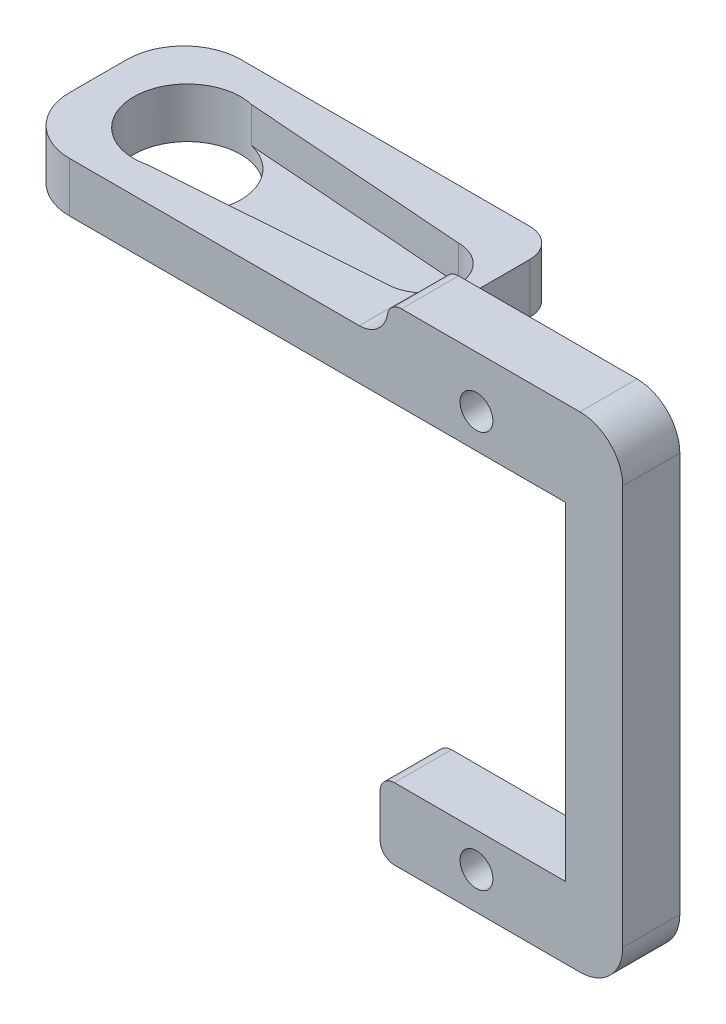
ISO-10303-21;
HEADER;
FILE_DESCRIPTION(('STEP AP214'),'2;1');
FILE_NAME('part.step','',(''),(''),'','','');
FILE_SCHEMA(('AUTOMOTIVE_DESIGN { 1 0 10303 214 1 1 1 1 }'));
ENDSEC;
DATA;
#1=APPLICATION_CONTEXT('core data for automotive mechanical design processes');
#2=APPLICATION_PROTOCOL_DEFINITION('international standard','automotive_design',2000,#1);
#3=PRODUCT_CONTEXT('',#1,'mechanical');
#4=PRODUCT('Part','Part','',(#3));
#5=PRODUCT_RELATED_PRODUCT_CATEGORY('part','',(#4));
#6=PRODUCT_DEFINITION_FORMATION('','',#4);
#7=PRODUCT_DEFINITION_CONTEXT('part definition',#1,'design');
#8=PRODUCT_DEFINITION('design','',#6,#7);
#9=PRODUCT_DEFINITION_SHAPE('','',#8);
#10=(LENGTH_UNIT() NAMED_UNIT(*) SI_UNIT(.MILLI.,.METRE.));
#11=(NAMED_UNIT(*) PLANE_ANGLE_UNIT() SI_UNIT($,.RADIAN.));
#12=(NAMED_UNIT(*) SI_UNIT($,.STERADIAN.) SOLID_ANGLE_UNIT());
#13=UNCERTAINTY_MEASURE_WITH_UNIT(LENGTH_MEASURE(1.E-05),#10,'distance_accuracy_value','');
#14=(GEOMETRIC_REPRESENTATION_CONTEXT(3) GLOBAL_UNCERTAINTY_ASSIGNED_CONTEXT((#13)) GLOBAL_UNIT_ASSIGNED_CONTEXT((#10,
#11,#12)) REPRESENTATION_CONTEXT('',''));
#15=CARTESIAN_POINT('',(0.,0.,0.));
#16=DIRECTION('',(0.,0.,1.));
#17=DIRECTION('',(1.,0.,0.));
#18=AXIS2_PLACEMENT_3D('',#15,#16,#17);
#19=CARTESIAN_POINT('',(24.875,-28.,2.));
#20=DIRECTION('',(1.,0.,0.));
#21=DIRECTION('',(0.,0.,1.));
#22=AXIS2_PLACEMENT_3D('',#19,#20,#21);
#23=PLANE('',#22);
#24=DIRECTION('',(0.,0.,1.));
#25=VECTOR('',#24,1.);
#26=CARTESIAN_POINT('',(24.875,-23.,6.));
#27=LINE('',#26,#25);
#28=CARTESIAN_POINT('',(24.875,-23.,2.));
#29=VERTEX_POINT('',#28);
#30=CARTESIAN_POINT('',(24.875,-23.,6.));
#31=VERTEX_POINT('',#30);
#32=EDGE_CURVE('E217',#29,#31,#27,.T.);
#33=ORIENTED_EDGE('',*,*,#32,.T.);
#34=DIRECTION('',(0.,1.,0.));
#35=VECTOR('',#34,1.);
#36=CARTESIAN_POINT('',(24.875,-28.,6.));
#37=LINE('',#36,#35);
#38=CARTESIAN_POINT('',(24.875,0.,6.));
#39=VERTEX_POINT('',#38);
#40=EDGE_CURVE('E220',#31,#39,#37,.T.);
#41=ORIENTED_EDGE('',*,*,#40,.T.);
#42=DIRECTION('',(0.,0.,1.));
#43=VECTOR('',#42,1.);
#44=CARTESIAN_POINT('',(24.875,0.,2.));
#45=LINE('',#44,#43);
#46=CARTESIAN_POINT('',(24.875,0.,2.));
#47=VERTEX_POINT('',#46);
#48=EDGE_CURVE('E211',#47,#39,#45,.T.);
#49=ORIENTED_EDGE('',*,*,#48,.F.);
#50=DIRECTION('',(0.,1.,0.));
#51=VECTOR('',#50,1.);
#52=CARTESIAN_POINT('',(24.875,-28.,2.));
#53=LINE('',#52,#51);
#54=EDGE_CURVE('E204',#29,#47,#53,.T.);
#55=ORIENTED_EDGE('',*,*,#54,.F.);
#56=EDGE_LOOP('',(#33,#41,#49,#55));
#57=FACE_BOUND('',#56,.T.);
#58=ADVANCED_FACE('F37',(#57),#23,.F.);
#59=CARTESIAN_POINT('',(0.,0.,0.));
#60=DIRECTION('',(0.,1.,0.));
#61=DIRECTION('',(0.,0.,-1.));
#62=AXIS2_PLACEMENT_3D('',#59,#60,#61);
#63=PLANE('',#62);
#64=CARTESIAN_POINT('',(-7.62500000000001,0.,0.00935841618816477));
#65=DIRECTION('',(0.,-1.,0.));
#66=DIRECTION('',(0.,0.,-1.));
#67=AXIS2_PLACEMENT_3D('',#64,#65,#66);
#68=CIRCLE('',#67,3.75);
#69=CARTESIAN_POINT('',(-7.62500000000001,0.,-3.74064158381184));
#70=VERTEX_POINT('',#69);
#71=EDGE_CURVE('E280',#70,#70,#68,.T.);
#72=ORIENTED_EDGE('',*,*,#71,.F.);
#73=EDGE_LOOP('',(#72));
#74=FACE_BOUND('',#73,.T.);
#75=DIRECTION('',(0.,0.,-1.));
#76=VECTOR('',#75,1.);
#77=CARTESIAN_POINT('',(12.375,0.,0.));
#78=LINE('',#77,#76);
#79=CARTESIAN_POINT('',(12.375,0.,2.));
#80=VERTEX_POINT('',#79);
#81=CARTESIAN_POINT('',(12.375,0.,-4.));
#82=VERTEX_POINT('',#81);
#83=EDGE_CURVE('E283',#80,#82,#78,.T.);
#84=ORIENTED_EDGE('',*,*,#83,.F.);
#85=DIRECTION('',(-1.,0.,0.));
#86=VECTOR('',#85,1.);
#87=CARTESIAN_POINT('',(24.875,0.,2.));
#88=LINE('',#87,#86);
#89=EDGE_CURVE('E251',#47,#80,#88,.T.);
#90=ORIENTED_EDGE('',*,*,#89,.F.);
#91=ORIENTED_EDGE('',*,*,#48,.T.);
#92=DIRECTION('',(1.,0.,0.));
#93=VECTOR('',#92,1.);
#94=CARTESIAN_POINT('',(0.,0.,6.));
#95=LINE('',#94,#93);
#96=CARTESIAN_POINT('',(-9.875,0.,6.));
#97=VERTEX_POINT('',#96);
#98=EDGE_CURVE('E298',#97,#39,#95,.T.);
#99=ORIENTED_EDGE('',*,*,#98,.F.);
#100=CARTESIAN_POINT('',(-9.875,0.,2.));
#101=DIRECTION('',(0.,-1.,0.));
#102=DIRECTION('',(0.,0.,-1.));
#103=AXIS2_PLACEMENT_3D('',#100,#101,#102);
#104=CIRCLE('',#103,4.);
#105=CARTESIAN_POINT('',(-13.875,0.,2.));
#106=VERTEX_POINT('',#105);
#107=EDGE_CURVE('E347',#106,#97,#104,.F.);
#108=ORIENTED_EDGE('',*,*,#107,.F.);
#109=DIRECTION('',(0.,0.,-1.));
#110=VECTOR('',#109,1.);
#111=CARTESIAN_POINT('',(-13.875,0.,0.));
#112=LINE('',#111,#110);
#113=CARTESIAN_POINT('',(-13.875,0.,-2.));
#114=VERTEX_POINT('',#113);
#115=EDGE_CURVE('E415',#106,#114,#112,.T.);
#116=ORIENTED_EDGE('',*,*,#115,.T.);
#117=CARTESIAN_POINT('',(-9.875,0.,-2.));
#118=DIRECTION('',(0.,-1.,0.));
#119=DIRECTION('',(0.,0.,-1.));
#120=AXIS2_PLACEMENT_3D('',#117,#118,#119);
#121=CIRCLE('',#120,4.);
#122=CARTESIAN_POINT('',(-9.875,0.,-6.));
#123=VERTEX_POINT('',#122);
#124=EDGE_CURVE('E342',#123,#114,#121,.F.);
#125=ORIENTED_EDGE('',*,*,#124,.F.);
#126=DIRECTION('',(1.,0.,0.));
#127=VECTOR('',#126,1.);
#128=CARTESIAN_POINT('',(0.,0.,-6.));
#129=LINE('',#128,#127);
#130=CARTESIAN_POINT('',(10.375,0.,-6.));
#131=VERTEX_POINT('',#130);
#132=EDGE_CURVE('E289',#123,#131,#129,.T.);
#133=ORIENTED_EDGE('',*,*,#132,.T.);
#134=CARTESIAN_POINT('',(10.375,0.,-4.));
#135=DIRECTION('',(0.,-1.,0.));
#136=DIRECTION('',(0.,0.,-1.));
#137=AXIS2_PLACEMENT_3D('',#134,#135,#136);
#138=CIRCLE('',#137,2.);
#139=EDGE_CURVE('E358',#82,#131,#138,.F.);
#140=ORIENTED_EDGE('',*,*,#139,.F.);
#141=EDGE_LOOP('',(#84,#90,#91,#99,#108,#116,#125,#133,#140));
#142=FACE_BOUND('',#141,.T.);
#143=ADVANCED_FACE('F422',(#74,#142),#63,.F.);
#144=CARTESIAN_POINT('',(12.375,3.5,0.));
#145=DIRECTION('',(1.,0.,0.));
#146=DIRECTION('',(0.,0.,1.));
#147=AXIS2_PLACEMENT_3D('',#144,#145,#146);
#148=PLANE('',#147);
#149=DIRECTION('',(0.,0.,-1.));
#150=VECTOR('',#149,1.);
#151=CARTESIAN_POINT('',(12.375,3.5,0.));
#152=LINE('',#151,#150);
#153=CARTESIAN_POINT('',(12.375,3.5,2.));
#154=VERTEX_POINT('',#153);
#155=CARTESIAN_POINT('',(12.375,3.5,-4.));
#156=VERTEX_POINT('',#155);
#157=EDGE_CURVE('E286',#154,#156,#152,.T.);
#158=ORIENTED_EDGE('',*,*,#157,.F.);
#159=DIRECTION('',(0.,-1.,0.));
#160=VECTOR('',#159,1.);
#161=CARTESIAN_POINT('',(12.375,3.5,2.));
#162=LINE('',#161,#160);
#163=EDGE_CURVE('E249',#154,#80,#162,.T.);
#164=ORIENTED_EDGE('',*,*,#163,.T.);
#165=ORIENTED_EDGE('',*,*,#83,.T.);
#166=DIRECTION('',(0.,-1.,0.));
#167=VECTOR('',#166,1.);
#168=CARTESIAN_POINT('',(12.375,0.,-4.));
#169=LINE('',#168,#167);
#170=EDGE_CURVE('E356',#156,#82,#169,.T.);
#171=ORIENTED_EDGE('',*,*,#170,.F.);
#172=EDGE_LOOP('',(#158,#164,#165,#171));
#173=FACE_BOUND('',#172,.T.);
#174=ADVANCED_FACE('F439',(#173),#148,.T.);
#175=CARTESIAN_POINT('',(0.,3.5,6.));
#176=DIRECTION('',(0.,0.,1.));
#177=DIRECTION('',(-1.,0.,0.));
#178=AXIS2_PLACEMENT_3D('',#175,#176,#177);
#179=PLANE('',#178);
#180=CARTESIAN_POINT('',(18.625,2.4,6.));
#181=DIRECTION('',(0.,0.,-1.));
#182=DIRECTION('',(-1.,0.,0.));
#183=AXIS2_PLACEMENT_3D('',#180,#181,#182);
#184=CIRCLE('',#183,1.15);
#185=CARTESIAN_POINT('',(19.775,2.4,6.00000000000001));
#186=VERTEX_POINT('',#185);
#187=EDGE_CURVE('E310',#186,#186,#184,.T.);
#188=ORIENTED_EDGE('',*,*,#187,.T.);
#189=EDGE_LOOP('',(#188));
#190=FACE_BOUND('',#189,.T.);
#191=CARTESIAN_POINT('',(18.625,-25.4,6.));
#192=DIRECTION('',(0.,0.,-1.));
#193=DIRECTION('',(-1.,0.,0.));
#194=AXIS2_PLACEMENT_3D('',#191,#192,#193);
#195=CIRCLE('',#194,1.15);
#196=CARTESIAN_POINT('',(19.775,-25.4,6.00000000000001));
#197=VERTEX_POINT('',#196);
#198=EDGE_CURVE('E305',#197,#197,#195,.T.);
#199=ORIENTED_EDGE('',*,*,#198,.T.);
#200=EDGE_LOOP('',(#199));
#201=FACE_BOUND('',#200,.T.);
#202=DIRECTION('',(0.,1.,0.));
#203=VECTOR('',#202,1.);
#204=CARTESIAN_POINT('',(28.875,3.5,6.));
#205=LINE('',#204,#203);
#206=CARTESIAN_POINT('',(28.875,-25.,6.));
#207=VERTEX_POINT('',#206);
#208=CARTESIAN_POINT('',(28.875,3.,6.));
#209=VERTEX_POINT('',#208);
#210=EDGE_CURVE('E246',#207,#209,#205,.T.);
#211=ORIENTED_EDGE('',*,*,#210,.T.);
#212=CARTESIAN_POINT('',(25.875,3.,6.));
#213=DIRECTION('',(0.,0.,-1.));
#214=DIRECTION('',(-1.,0.,0.));
#215=AXIS2_PLACEMENT_3D('',#212,#213,#214);
#216=CIRCLE('',#215,3.);
#217=CARTESIAN_POINT('',(25.875,6.,6.));
#218=VERTEX_POINT('',#217);
#219=EDGE_CURVE('E378',#218,#209,#216,.T.);
#220=ORIENTED_EDGE('',*,*,#219,.F.);
#221=DIRECTION('',(-1.,0.,0.));
#222=VECTOR('',#221,1.);
#223=CARTESIAN_POINT('',(12.375,6.,6.));
#224=LINE('',#223,#222);
#225=CARTESIAN_POINT('',(13.375,6.,6.));
#226=VERTEX_POINT('',#225);
#227=EDGE_CURVE('E226',#218,#226,#224,.T.);
#228=ORIENTED_EDGE('',*,*,#227,.T.);
#229=CARTESIAN_POINT('',(13.375,5.,6.));
#230=DIRECTION('',(0.,0.,-1.));
#231=DIRECTION('',(-1.,0.,0.));
#232=AXIS2_PLACEMENT_3D('',#229,#230,#231);
#233=CIRCLE('',#232,1.);
#234=CARTESIAN_POINT('',(12.3889867028167,5.16666666666667,6.));
#235=VERTEX_POINT('',#234);
#236=EDGE_CURVE('E323',#235,#226,#233,.T.);
#237=ORIENTED_EDGE('',*,*,#236,.F.);
#238=CARTESIAN_POINT('',(10.4169601084502,5.5,6.));
#239=DIRECTION('',(0.,0.,-1.));
#240=DIRECTION('',(-1.,0.,0.));
#241=AXIS2_PLACEMENT_3D('',#238,#239,#240);
#242=CIRCLE('',#241,2.);
#243=CARTESIAN_POINT('',(10.4169601084502,3.5,6.));
#244=VERTEX_POINT('',#243);
#245=EDGE_CURVE('E11',#244,#235,#242,.F.);
#246=ORIENTED_EDGE('',*,*,#245,.F.);
#247=DIRECTION('',(1.,0.,0.));
#248=VECTOR('',#247,1.);
#249=CARTESIAN_POINT('',(0.,3.5,6.));
#250=LINE('',#249,#248);
#251=CARTESIAN_POINT('',(-9.875,3.5,6.));
#252=VERTEX_POINT('',#251);
#253=EDGE_CURVE('E288',#252,#244,#250,.T.);
#254=ORIENTED_EDGE('',*,*,#253,.F.);
#255=DIRECTION('',(0.,-1.,0.));
#256=VECTOR('',#255,1.);
#257=CARTESIAN_POINT('',(-9.875,3.5,6.));
#258=LINE('',#257,#256);
#259=EDGE_CURVE('E350',#97,#252,#258,.F.);
#260=ORIENTED_EDGE('',*,*,#259,.F.);
#261=ORIENTED_EDGE('',*,*,#98,.T.);
#262=ORIENTED_EDGE('',*,*,#40,.F.);
#263=DIRECTION('',(1.,0.,0.));
#264=VECTOR('',#263,1.);
#265=CARTESIAN_POINT('',(11.875,-23.,6.00000000000002));
#266=LINE('',#265,#264);
#267=CARTESIAN_POINT('',(12.875,-23.,6.00000000000001));
#268=VERTEX_POINT('',#267);
#269=EDGE_CURVE('E212',#268,#31,#266,.T.);
#270=ORIENTED_EDGE('',*,*,#269,.F.);
#271=CARTESIAN_POINT('',(12.875,-24.,6.));
#272=DIRECTION('',(0.,0.,-1.));
#273=DIRECTION('',(-1.,0.,0.));
#274=AXIS2_PLACEMENT_3D('',#271,#272,#273);
#275=CIRCLE('',#274,1.);
#276=CARTESIAN_POINT('',(11.875,-24.,6.00000000000002));
#277=VERTEX_POINT('',#276);
#278=EDGE_CURVE('E326',#277,#268,#275,.T.);
#279=ORIENTED_EDGE('',*,*,#278,.F.);
#280=DIRECTION('',(0.,-1.,0.));
#281=VECTOR('',#280,1.);
#282=CARTESIAN_POINT('',(11.875,-28.,6.00000000000002));
#283=LINE('',#282,#281);
#284=CARTESIAN_POINT('',(11.875,-27.,6.00000000000002));
#285=VERTEX_POINT('',#284);
#286=EDGE_CURVE('E225',#277,#285,#283,.T.);
#287=ORIENTED_EDGE('',*,*,#286,.T.);
#288=CARTESIAN_POINT('',(12.875,-27.,6.));
#289=DIRECTION('',(0.,0.,-1.));
#290=DIRECTION('',(-1.,0.,0.));
#291=AXIS2_PLACEMENT_3D('',#288,#289,#290);
#292=CIRCLE('',#291,1.);
#293=CARTESIAN_POINT('',(12.875,-28.,6.));
#294=VERTEX_POINT('',#293);
#295=EDGE_CURVE('E329',#294,#285,#292,.T.);
#296=ORIENTED_EDGE('',*,*,#295,.F.);
#297=DIRECTION('',(1.,0.,0.));
#298=VECTOR('',#297,1.);
#299=CARTESIAN_POINT('',(28.875,-28.,6.));
#300=LINE('',#299,#298);
#301=CARTESIAN_POINT('',(25.875,-28.,6.));
#302=VERTEX_POINT('',#301);
#303=EDGE_CURVE('E239',#294,#302,#300,.T.);
#304=ORIENTED_EDGE('',*,*,#303,.T.);
#305=CARTESIAN_POINT('',(25.875,-25.,6.));
#306=DIRECTION('',(0.,0.,-1.));
#307=DIRECTION('',(-1.,0.,0.));
#308=AXIS2_PLACEMENT_3D('',#305,#306,#307);
#309=CIRCLE('',#308,3.);
#310=EDGE_CURVE('E381',#207,#302,#309,.T.);
#311=ORIENTED_EDGE('',*,*,#310,.F.);
#312=EDGE_LOOP('',(#211,#220,#228,#237,#246,#254,#260,#261,#262,#270,#279,#287,#296,#304,#311));
#313=FACE_BOUND('',#312,.T.);
#314=ADVANCED_FACE('F398',(#190,#201,#313),#179,.T.);
#315=CARTESIAN_POINT('',(0.,3.5,-6.));
#316=DIRECTION('',(0.,0.,1.));
#317=DIRECTION('',(-1.,0.,0.));
#318=AXIS2_PLACEMENT_3D('',#315,#316,#317);
#319=PLANE('',#318);
#320=ORIENTED_EDGE('',*,*,#132,.F.);
#321=DIRECTION('',(0.,1.,0.));
#322=VECTOR('',#321,1.);
#323=CARTESIAN_POINT('',(-9.875,0.,-6.));
#324=LINE('',#323,#322);
#325=CARTESIAN_POINT('',(-9.875,3.5,-6.));
#326=VERTEX_POINT('',#325);
#327=EDGE_CURVE('E340',#326,#123,#324,.F.);
#328=ORIENTED_EDGE('',*,*,#327,.F.);
#329=DIRECTION('',(1.,0.,0.));
#330=VECTOR('',#329,1.);
#331=CARTESIAN_POINT('',(0.,3.5,-6.));
#332=LINE('',#331,#330);
#333=CARTESIAN_POINT('',(10.375,3.5,-6.));
#334=VERTEX_POINT('',#333);
#335=EDGE_CURVE('E292',#326,#334,#332,.T.);
#336=ORIENTED_EDGE('',*,*,#335,.T.);
#337=DIRECTION('',(0.,-1.,0.));
#338=VECTOR('',#337,1.);
#339=CARTESIAN_POINT('',(10.375,3.5,-6.));
#340=LINE('',#339,#338);
#341=EDGE_CURVE('E361',#131,#334,#340,.F.);
#342=ORIENTED_EDGE('',*,*,#341,.F.);
#343=EDGE_LOOP('',(#320,#328,#336,#342));
#344=FACE_BOUND('',#343,.T.);
#345=ADVANCED_FACE('F434',(#344),#319,.F.);
#346=CARTESIAN_POINT('',(0.,3.5,0.));
#347=DIRECTION('',(0.,1.,0.));
#348=DIRECTION('',(0.,0.,-1.));
#349=AXIS2_PLACEMENT_3D('',#346,#347,#348);
#350=PLANE('',#349);
#351=ORIENTED_EDGE('',*,*,#157,.T.);
#352=CARTESIAN_POINT('',(10.375,3.5,-4.));
#353=DIRECTION('',(0.,-1.,0.));
#354=DIRECTION('',(0.,0.,-1.));
#355=AXIS2_PLACEMENT_3D('',#352,#353,#354);
#356=CIRCLE('',#355,2.);
#357=EDGE_CURVE('E364',#334,#156,#356,.T.);
#358=ORIENTED_EDGE('',*,*,#357,.F.);
#359=ORIENTED_EDGE('',*,*,#335,.F.);
#360=CARTESIAN_POINT('',(-9.875,3.5,-2.));
#361=DIRECTION('',(0.,-1.,0.));
#362=DIRECTION('',(0.,0.,-1.));
#363=AXIS2_PLACEMENT_3D('',#360,#361,#362);
#364=CIRCLE('',#363,4.);
#365=CARTESIAN_POINT('',(-13.875,3.5,-2.));
#366=VERTEX_POINT('',#365);
#367=EDGE_CURVE('E338',#366,#326,#364,.T.);
#368=ORIENTED_EDGE('',*,*,#367,.F.);
#369=DIRECTION('',(0.,0.,1.));
#370=VECTOR('',#369,1.);
#371=CARTESIAN_POINT('',(-13.875,3.5,0.));
#372=LINE('',#371,#370);
#373=CARTESIAN_POINT('',(-13.875,3.5,2.));
#374=VERTEX_POINT('',#373);
#375=EDGE_CURVE('E306',#366,#374,#372,.T.);
#376=ORIENTED_EDGE('',*,*,#375,.T.);
#377=CARTESIAN_POINT('',(-9.875,3.5,2.));
#378=DIRECTION('',(0.,-1.,0.));
#379=DIRECTION('',(0.,0.,-1.));
#380=AXIS2_PLACEMENT_3D('',#377,#378,#379);
#381=CIRCLE('',#380,4.);
#382=EDGE_CURVE('E353',#252,#374,#381,.T.);
#383=ORIENTED_EDGE('',*,*,#382,.F.);
#384=ORIENTED_EDGE('',*,*,#253,.T.);
#385=DIRECTION('',(0.,0.,1.));
#386=VECTOR('',#385,1.);
#387=CARTESIAN_POINT('',(10.4169601084502,3.5,6.));
#388=LINE('',#387,#386);
#389=CARTESIAN_POINT('',(10.4169601084502,3.5,2.));
#390=VERTEX_POINT('',#389);
#391=EDGE_CURVE('E388',#390,#244,#388,.T.);
#392=ORIENTED_EDGE('',*,*,#391,.F.);
#393=DIRECTION('',(-1.,0.,0.));
#394=VECTOR('',#393,1.);
#395=CARTESIAN_POINT('',(0.,3.5,2.));
#396=LINE('',#395,#394);
#397=EDGE_CURVE('E52',#154,#390,#396,.T.);
#398=ORIENTED_EDGE('',*,*,#397,.F.);
#399=EDGE_LOOP('',(#351,#358,#359,#368,#376,#383,#384,#392,#398));
#400=FACE_BOUND('',#399,.T.);
#401=DIRECTION('',(-0.997307545554175,0.,0.073332527439784));
#402=VECTOR('',#401,1.);
#403=CARTESIAN_POINT('',(-6.76476747329574,3.5,3.65935841618816));
#404=LINE('',#403,#402);
#405=CARTESIAN_POINT('',(8.875,3.5,2.50935841618817));
#406=VERTEX_POINT('',#405);
#407=CARTESIAN_POINT('',(-6.76476747329574,3.5,3.65935841618816));
#408=VERTEX_POINT('',#407);
#409=EDGE_CURVE('E258',#406,#408,#404,.T.);
#410=ORIENTED_EDGE('',*,*,#409,.T.);
#411=CARTESIAN_POINT('',(-7.62500000000001,3.5,0.00935841618816477));
#412=DIRECTION('',(0.,-1.,0.));
#413=DIRECTION('',(0.,0.,-1.));
#414=AXIS2_PLACEMENT_3D('',#411,#412,#413);
#415=CIRCLE('',#414,3.75);
#416=CARTESIAN_POINT('',(-6.76476747329574,3.5,-3.64064158381184));
#417=VERTEX_POINT('',#416);
#418=EDGE_CURVE('E274',#408,#417,#415,.T.);
#419=ORIENTED_EDGE('',*,*,#418,.T.);
#420=DIRECTION('',(0.997307545554175,0.,0.073332527439784));
#421=VECTOR('',#420,1.);
#422=CARTESIAN_POINT('',(-6.76476747329574,3.5,-3.64064158381184));
#423=LINE('',#422,#421);
#424=CARTESIAN_POINT('',(8.87500000000002,3.5,-2.49064158381184));
#425=VERTEX_POINT('',#424);
#426=EDGE_CURVE('E253',#417,#425,#423,.T.);
#427=ORIENTED_EDGE('',*,*,#426,.T.);
#428=CARTESIAN_POINT('',(8.875,3.5,0.00935841618816478));
#429=DIRECTION('',(0.,-1.,0.));
#430=DIRECTION('',(0.,0.,-1.));
#431=AXIS2_PLACEMENT_3D('',#428,#429,#430);
#432=CIRCLE('',#431,2.5);
#433=EDGE_CURVE('E267',#425,#406,#432,.T.);
#434=ORIENTED_EDGE('',*,*,#433,.T.);
#435=EDGE_LOOP('',(#410,#419,#427,#434));
#436=FACE_BOUND('',#435,.T.);
#437=ADVANCED_FACE('F392',(#400,#436),#350,.T.);
#438=CARTESIAN_POINT('',(-7.62500000000001,0.,0.00935841618816477));
#439=DIRECTION('',(0.,1.,0.));
#440=DIRECTION('',(0.,0.,-1.));
#441=AXIS2_PLACEMENT_3D('',#438,#439,#440);
#442=CYLINDRICAL_SURFACE('',#441,3.75);
#443=ORIENTED_EDGE('',*,*,#71,.T.);
#444=EDGE_LOOP('',(#443));
#445=FACE_BOUND('',#444,.T.);
#446=CARTESIAN_POINT('',(-7.62500000000001,1.,0.00935841618816432));
#447=DIRECTION('',(0.,1.,0.));
#448=DIRECTION('',(0.,0.,1.));
#449=AXIS2_PLACEMENT_3D('',#446,#447,#448);
#450=CIRCLE('',#449,3.75);
#451=CARTESIAN_POINT('',(-6.76476747329574,1.,3.65935841618816));
#452=VERTEX_POINT('',#451);
#453=CARTESIAN_POINT('',(-6.76476747329574,1.,-3.64064158381184));
#454=VERTEX_POINT('',#453);
#455=EDGE_CURVE('E254',#452,#454,#450,.T.);
#456=ORIENTED_EDGE('',*,*,#455,.T.);
#457=DIRECTION('',(0.,1.,0.));
#458=VECTOR('',#457,1.);
#459=CARTESIAN_POINT('',(-6.76476747329574,1.,-3.64064158381184));
#460=LINE('',#459,#458);
#461=EDGE_CURVE('E264',#454,#417,#460,.T.);
#462=ORIENTED_EDGE('',*,*,#461,.T.);
#463=ORIENTED_EDGE('',*,*,#418,.F.);
#464=DIRECTION('',(0.,1.,0.));
#465=VECTOR('',#464,1.);
#466=CARTESIAN_POINT('',(-6.76476747329574,1.,3.65935841618816));
#467=LINE('',#466,#465);
#468=EDGE_CURVE('E272',#452,#408,#467,.T.);
#469=ORIENTED_EDGE('',*,*,#468,.F.);
#470=EDGE_LOOP('',(#456,#462,#463,#469));
#471=FACE_BOUND('',#470,.T.);
#472=ADVANCED_FACE('F482',(#445,#471),#442,.F.);
#473=CARTESIAN_POINT('',(-6.76476747329574,1.,3.65935841618816));
#474=DIRECTION('',(0.073332527439784,0.,0.997307545554175));
#475=DIRECTION('',(-0.997307545554175,0.,0.073332527439784));
#476=AXIS2_PLACEMENT_3D('',#473,#474,#475);
#477=PLANE('',#476);
#478=ORIENTED_EDGE('',*,*,#409,.F.);
#479=DIRECTION('',(0.,1.,0.));
#480=VECTOR('',#479,1.);
#481=CARTESIAN_POINT('',(8.875,1.,2.50935841618817));
#482=LINE('',#481,#480);
#483=CARTESIAN_POINT('',(8.875,1.,2.50935841618817));
#484=VERTEX_POINT('',#483);
#485=EDGE_CURVE('E275',#484,#406,#482,.T.);
#486=ORIENTED_EDGE('',*,*,#485,.F.);
#487=DIRECTION('',(-0.997307545554175,0.,0.073332527439784));
#488=VECTOR('',#487,1.);
#489=CARTESIAN_POINT('',(-6.76476747329574,1.,3.65935841618816));
#490=LINE('',#489,#488);
#491=EDGE_CURVE('E262',#484,#452,#490,.T.);
#492=ORIENTED_EDGE('',*,*,#491,.T.);
#493=ORIENTED_EDGE('',*,*,#468,.T.);
#494=EDGE_LOOP('',(#478,#486,#492,#493));
#495=FACE_BOUND('',#494,.T.);
#496=ADVANCED_FACE('F478',(#495),#477,.F.);
#497=CARTESIAN_POINT('',(8.875,1.,0.00935841618816478));
#498=DIRECTION('',(0.,1.,0.));
#499=DIRECTION('',(0.,0.,-1.));
#500=AXIS2_PLACEMENT_3D('',#497,#498,#499);
#501=CYLINDRICAL_SURFACE('',#500,2.5);
#502=ORIENTED_EDGE('',*,*,#433,.F.);
#503=DIRECTION('',(0.,1.,0.));
#504=VECTOR('',#503,1.);
#505=CARTESIAN_POINT('',(8.87500000000002,1.,-2.49064158381184));
#506=LINE('',#505,#504);
#507=CARTESIAN_POINT('',(8.87500000000002,1.,-2.49064158381184));
#508=VERTEX_POINT('',#507);
#509=EDGE_CURVE('E277',#508,#425,#506,.T.);
#510=ORIENTED_EDGE('',*,*,#509,.F.);
#511=CARTESIAN_POINT('',(8.875,1.,0.00935841618816478));
#512=DIRECTION('',(0.,-1.,0.));
#513=DIRECTION('',(0.,0.,-1.));
#514=AXIS2_PLACEMENT_3D('',#511,#512,#513);
#515=CIRCLE('',#514,2.5);
#516=EDGE_CURVE('E260',#508,#484,#515,.T.);
#517=ORIENTED_EDGE('',*,*,#516,.T.);
#518=ORIENTED_EDGE('',*,*,#485,.T.);
#519=EDGE_LOOP('',(#502,#510,#517,#518));
#520=FACE_BOUND('',#519,.T.);
#521=ADVANCED_FACE('F481',(#520),#501,.F.);
#522=CARTESIAN_POINT('',(-6.76476747329574,1.,-3.64064158381184));
#523=DIRECTION('',(0.073332527439784,0.,-0.997307545554175));
#524=DIRECTION('',(0.997307545554175,0.,0.073332527439784));
#525=AXIS2_PLACEMENT_3D('',#522,#523,#524);
#526=PLANE('',#525);
#527=ORIENTED_EDGE('',*,*,#426,.F.);
#528=ORIENTED_EDGE('',*,*,#461,.F.);
#529=DIRECTION('',(0.997307545554175,0.,0.073332527439784));
#530=VECTOR('',#529,1.);
#531=CARTESIAN_POINT('',(-6.76476747329574,1.,-3.64064158381184));
#532=LINE('',#531,#530);
#533=EDGE_CURVE('E257',#454,#508,#532,.T.);
#534=ORIENTED_EDGE('',*,*,#533,.T.);
#535=ORIENTED_EDGE('',*,*,#509,.T.);
#536=EDGE_LOOP('',(#527,#528,#534,#535));
#537=FACE_BOUND('',#536,.T.);
#538=ADVANCED_FACE('F476',(#537),#526,.F.);
#539=CARTESIAN_POINT('',(-7.62500000000001,1.,0.00935841618816432));
#540=DIRECTION('',(0.,-1.,0.));
#541=DIRECTION('',(0.,0.,1.));
#542=AXIS2_PLACEMENT_3D('',#539,#540,#541);
#543=PLANE('',#542);
#544=ORIENTED_EDGE('',*,*,#455,.F.);
#545=ORIENTED_EDGE('',*,*,#491,.F.);
#546=ORIENTED_EDGE('',*,*,#516,.F.);
#547=ORIENTED_EDGE('',*,*,#533,.F.);
#548=EDGE_LOOP('',(#544,#545,#546,#547));
#549=FACE_BOUND('',#548,.T.);
#550=ADVANCED_FACE('F472',(#549),#543,.F.);
#551=CARTESIAN_POINT('',(24.875,3.5,2.));
#552=DIRECTION('',(0.,0.,1.));
#553=DIRECTION('',(0.,1.,0.));
#554=AXIS2_PLACEMENT_3D('',#551,#552,#553);
#555=PLANE('',#554);
#556=CARTESIAN_POINT('',(18.625,2.4,2.));
#557=DIRECTION('',(0.,0.,-1.));
#558=DIRECTION('',(0.,1.,0.));
#559=AXIS2_PLACEMENT_3D('',#556,#557,#558);
#560=CIRCLE('',#559,1.15);
#561=CARTESIAN_POINT('',(19.775,2.4,2.));
#562=VERTEX_POINT('',#561);
#563=EDGE_CURVE('E307',#562,#562,#560,.T.);
#564=ORIENTED_EDGE('',*,*,#563,.F.);
#565=EDGE_LOOP('',(#564));
#566=FACE_BOUND('',#565,.T.);
#567=CARTESIAN_POINT('',(18.625,-25.4,2.00000000000001));
#568=DIRECTION('',(0.,0.,-1.));
#569=DIRECTION('',(0.,1.,0.));
#570=AXIS2_PLACEMENT_3D('',#567,#568,#569);
#571=CIRCLE('',#570,1.15);
#572=CARTESIAN_POINT('',(19.775,-25.4,2.00000000000002));
#573=VERTEX_POINT('',#572);
#574=EDGE_CURVE('E302',#573,#573,#571,.T.);
#575=ORIENTED_EDGE('',*,*,#574,.F.);
#576=EDGE_LOOP('',(#575));
#577=FACE_BOUND('',#576,.T.);
#578=DIRECTION('',(-1.,0.,0.));
#579=VECTOR('',#578,1.);
#580=CARTESIAN_POINT('',(28.875,-28.,2.));
#581=LINE('',#580,#579);
#582=CARTESIAN_POINT('',(25.875,-28.,2.));
#583=VERTEX_POINT('',#582);
#584=CARTESIAN_POINT('',(12.875,-28.,2.));
#585=VERTEX_POINT('',#584);
#586=EDGE_CURVE('E237',#583,#585,#581,.T.);
#587=ORIENTED_EDGE('',*,*,#586,.T.);
#588=CARTESIAN_POINT('',(12.875,-27.,2.));
#589=DIRECTION('',(0.,0.,-1.));
#590=DIRECTION('',(0.,1.,0.));
#591=AXIS2_PLACEMENT_3D('',#588,#589,#590);
#592=CIRCLE('',#591,1.);
#593=CARTESIAN_POINT('',(11.875,-27.,2.00000000000002));
#594=VERTEX_POINT('',#593);
#595=EDGE_CURVE('E318',#594,#585,#592,.F.);
#596=ORIENTED_EDGE('',*,*,#595,.F.);
#597=DIRECTION('',(0.,1.,0.));
#598=VECTOR('',#597,1.);
#599=CARTESIAN_POINT('',(11.875,-28.,2.00000000000002));
#600=LINE('',#599,#598);
#601=CARTESIAN_POINT('',(11.875,-24.,2.00000000000002));
#602=VERTEX_POINT('',#601);
#603=EDGE_CURVE('E229',#594,#602,#600,.T.);
#604=ORIENTED_EDGE('',*,*,#603,.T.);
#605=CARTESIAN_POINT('',(12.875,-24.,2.));
#606=DIRECTION('',(0.,0.,-1.));
#607=DIRECTION('',(0.,1.,0.));
#608=AXIS2_PLACEMENT_3D('',#605,#606,#607);
#609=CIRCLE('',#608,1.);
#610=CARTESIAN_POINT('',(12.875,-23.,2.00000000000001));
#611=VERTEX_POINT('',#610);
#612=EDGE_CURVE('E208',#611,#602,#609,.F.);
#613=ORIENTED_EDGE('',*,*,#612,.F.);
#614=DIRECTION('',(1.,0.,0.));
#615=VECTOR('',#614,1.);
#616=CARTESIAN_POINT('',(11.875,-23.,2.00000000000002));
#617=LINE('',#616,#615);
#618=EDGE_CURVE('E199',#611,#29,#617,.T.);
#619=ORIENTED_EDGE('',*,*,#618,.T.);
#620=ORIENTED_EDGE('',*,*,#54,.T.);
#621=ORIENTED_EDGE('',*,*,#89,.T.);
#622=ORIENTED_EDGE('',*,*,#163,.F.);
#623=ORIENTED_EDGE('',*,*,#397,.T.);
#624=CARTESIAN_POINT('',(10.4169601084502,5.5,2.));
#625=DIRECTION('',(0.,0.,-1.));
#626=DIRECTION('',(0.,1.,0.));
#627=AXIS2_PLACEMENT_3D('',#624,#625,#626);
#628=CIRCLE('',#627,2.);
#629=CARTESIAN_POINT('',(12.3889867028167,5.16666666666667,2.));
#630=VERTEX_POINT('',#629);
#631=EDGE_CURVE('E45',#630,#390,#628,.T.);
#632=ORIENTED_EDGE('',*,*,#631,.F.);
#633=CARTESIAN_POINT('',(13.375,5.,2.));
#634=DIRECTION('',(0.,0.,-1.));
#635=DIRECTION('',(0.,1.,0.));
#636=AXIS2_PLACEMENT_3D('',#633,#634,#635);
#637=CIRCLE('',#636,1.);
#638=CARTESIAN_POINT('',(13.375,6.,2.));
#639=VERTEX_POINT('',#638);
#640=EDGE_CURVE('E314',#639,#630,#637,.F.);
#641=ORIENTED_EDGE('',*,*,#640,.F.);
#642=DIRECTION('',(1.,0.,0.));
#643=VECTOR('',#642,1.);
#644=CARTESIAN_POINT('',(12.375,6.,2.));
#645=LINE('',#644,#643);
#646=CARTESIAN_POINT('',(25.875,6.,2.));
#647=VERTEX_POINT('',#646);
#648=EDGE_CURVE('E232',#639,#647,#645,.T.);
#649=ORIENTED_EDGE('',*,*,#648,.T.);
#650=CARTESIAN_POINT('',(25.875,3.,2.));
#651=DIRECTION('',(0.,0.,-1.));
#652=DIRECTION('',(0.,1.,0.));
#653=AXIS2_PLACEMENT_3D('',#650,#651,#652);
#654=CIRCLE('',#653,3.);
#655=CARTESIAN_POINT('',(28.875,3.,2.));
#656=VERTEX_POINT('',#655);
#657=EDGE_CURVE('E368',#656,#647,#654,.F.);
#658=ORIENTED_EDGE('',*,*,#657,.F.);
#659=DIRECTION('',(0.,-1.,0.));
#660=VECTOR('',#659,1.);
#661=CARTESIAN_POINT('',(28.875,3.5,2.));
#662=LINE('',#661,#660);
#663=CARTESIAN_POINT('',(28.875,-25.,2.));
#664=VERTEX_POINT('',#663);
#665=EDGE_CURVE('E219',#656,#664,#662,.T.);
#666=ORIENTED_EDGE('',*,*,#665,.T.);
#667=CARTESIAN_POINT('',(25.875,-25.,2.));
#668=DIRECTION('',(0.,0.,-1.));
#669=DIRECTION('',(0.,1.,0.));
#670=AXIS2_PLACEMENT_3D('',#667,#668,#669);
#671=CIRCLE('',#670,3.);
#672=EDGE_CURVE('E371',#583,#664,#671,.F.);
#673=ORIENTED_EDGE('',*,*,#672,.F.);
#674=EDGE_LOOP('',(#587,#596,#604,#613,#619,#620,#621,#622,#623,#632,#641,#649,#658,#666,#673));
#675=FACE_BOUND('',#674,.T.);
#676=ADVANCED_FACE('F202',(#566,#577,#675),#555,.F.);
#677=CARTESIAN_POINT('',(28.875,0.,0.));
#678=DIRECTION('',(1.,0.,0.));
#679=DIRECTION('',(0.,0.,1.));
#680=AXIS2_PLACEMENT_3D('',#677,#678,#679);
#681=PLANE('',#680);
#682=ORIENTED_EDGE('',*,*,#665,.F.);
#683=DIRECTION('',(0.,0.,1.));
#684=VECTOR('',#683,1.);
#685=CARTESIAN_POINT('',(28.875,3.,2.));
#686=LINE('',#685,#684);
#687=EDGE_CURVE('E374',#209,#656,#686,.F.);
#688=ORIENTED_EDGE('',*,*,#687,.F.);
#689=ORIENTED_EDGE('',*,*,#210,.F.);
#690=DIRECTION('',(0.,0.,-1.));
#691=VECTOR('',#690,1.);
#692=CARTESIAN_POINT('',(28.875,-25.,6.));
#693=LINE('',#692,#691);
#694=EDGE_CURVE('E376',#664,#207,#693,.F.);
#695=ORIENTED_EDGE('',*,*,#694,.F.);
#696=EDGE_LOOP('',(#682,#688,#689,#695));
#697=FACE_BOUND('',#696,.T.);
#698=ADVANCED_FACE('F466',(#697),#681,.T.);
#699=CARTESIAN_POINT('',(0.,-28.,0.));
#700=DIRECTION('',(0.,1.,0.));
#701=DIRECTION('',(0.,0.,-1.));
#702=AXIS2_PLACEMENT_3D('',#699,#700,#701);
#703=PLANE('',#702);
#704=ORIENTED_EDGE('',*,*,#303,.F.);
#705=DIRECTION('',(0.,0.,-1.));
#706=VECTOR('',#705,1.);
#707=CARTESIAN_POINT('',(12.875,-28.,0.));
#708=LINE('',#707,#706);
#709=EDGE_CURVE('E321',#585,#294,#708,.F.);
#710=ORIENTED_EDGE('',*,*,#709,.F.);
#711=ORIENTED_EDGE('',*,*,#586,.F.);
#712=DIRECTION('',(0.,0.,-1.));
#713=VECTOR('',#712,1.);
#714=CARTESIAN_POINT('',(25.875,-28.,2.));
#715=LINE('',#714,#713);
#716=EDGE_CURVE('E366',#302,#583,#715,.T.);
#717=ORIENTED_EDGE('',*,*,#716,.F.);
#718=EDGE_LOOP('',(#704,#710,#711,#717));
#719=FACE_BOUND('',#718,.T.);
#720=ADVANCED_FACE('F464',(#719),#703,.F.);
#721=CARTESIAN_POINT('',(11.875,-23.,6.00000000000002));
#722=DIRECTION('',(0.,-1.,0.));
#723=DIRECTION('',(0.,0.,1.));
#724=AXIS2_PLACEMENT_3D('',#721,#722,#723);
#725=PLANE('',#724);
#726=ORIENTED_EDGE('',*,*,#269,.T.);
#727=ORIENTED_EDGE('',*,*,#32,.F.);
#728=ORIENTED_EDGE('',*,*,#618,.F.);
#729=DIRECTION('',(0.,0.,1.));
#730=VECTOR('',#729,1.);
#731=CARTESIAN_POINT('',(12.875,-23.,6.00000000000001));
#732=LINE('',#731,#730);
#733=EDGE_CURVE('E332',#268,#611,#732,.F.);
#734=ORIENTED_EDGE('',*,*,#733,.F.);
#735=EDGE_LOOP('',(#726,#727,#728,#734));
#736=FACE_BOUND('',#735,.T.);
#737=ADVANCED_FACE('F222',(#736),#725,.F.);
#738=CARTESIAN_POINT('',(11.875,0.,0.));
#739=DIRECTION('',(1.,0.,0.));
#740=DIRECTION('',(0.,0.,1.));
#741=AXIS2_PLACEMENT_3D('',#738,#739,#740);
#742=PLANE('',#741);
#743=ORIENTED_EDGE('',*,*,#286,.F.);
#744=DIRECTION('',(0.,0.,1.));
#745=VECTOR('',#744,1.);
#746=CARTESIAN_POINT('',(11.875,-24.,0.));
#747=LINE('',#746,#745);
#748=EDGE_CURVE('E295',#602,#277,#747,.T.);
#749=ORIENTED_EDGE('',*,*,#748,.F.);
#750=ORIENTED_EDGE('',*,*,#603,.F.);
#751=DIRECTION('',(0.,0.,-1.));
#752=VECTOR('',#751,1.);
#753=CARTESIAN_POINT('',(11.875,-27.,0.));
#754=LINE('',#753,#752);
#755=EDGE_CURVE('E312',#285,#594,#754,.T.);
#756=ORIENTED_EDGE('',*,*,#755,.F.);
#757=EDGE_LOOP('',(#743,#749,#750,#756));
#758=FACE_BOUND('',#757,.T.);
#759=ADVANCED_FACE('F531',(#758),#742,.F.);
#760=CARTESIAN_POINT('',(0.,6.,0.));
#761=DIRECTION('',(0.,-1.,0.));
#762=DIRECTION('',(0.,0.,1.));
#763=AXIS2_PLACEMENT_3D('',#760,#761,#762);
#764=PLANE('',#763);
#765=ORIENTED_EDGE('',*,*,#648,.F.);
#766=DIRECTION('',(0.,0.,-1.));
#767=VECTOR('',#766,1.);
#768=CARTESIAN_POINT('',(13.375,6.,0.));
#769=LINE('',#768,#767);
#770=EDGE_CURVE('E334',#226,#639,#769,.T.);
#771=ORIENTED_EDGE('',*,*,#770,.F.);
#772=ORIENTED_EDGE('',*,*,#227,.F.);
#773=DIRECTION('',(0.,0.,1.));
#774=VECTOR('',#773,1.);
#775=CARTESIAN_POINT('',(25.875,6.,6.));
#776=LINE('',#775,#774);
#777=EDGE_CURVE('E384',#647,#218,#776,.T.);
#778=ORIENTED_EDGE('',*,*,#777,.F.);
#779=EDGE_LOOP('',(#765,#771,#772,#778));
#780=FACE_BOUND('',#779,.T.);
#781=ADVANCED_FACE('F527',(#780),#764,.F.);
#782=CARTESIAN_POINT('',(18.625,-25.4,52.));
#783=DIRECTION('',(0.,0.,-1.));
#784=DIRECTION('',(1.,0.,0.));
#785=AXIS2_PLACEMENT_3D('',#782,#783,#784);
#786=CYLINDRICAL_SURFACE('',#785,1.15);
#787=CARTESIAN_POINT('',(19.775,-25.4,6.00000000000001));
#788=CARTESIAN_POINT('',(19.775,-25.4,5.95833333333334));
#789=CARTESIAN_POINT('',(19.775,-25.4,5.91666666666667));
#790=CARTESIAN_POINT('',(19.775,-25.4,5.83333333333334));
#791=CARTESIAN_POINT('',(19.775,-25.4,5.79166666666667));
#792=CARTESIAN_POINT('',(19.775,-25.4,5.70833333333334));
#793=CARTESIAN_POINT('',(19.775,-25.4,5.66666666666667));
#794=CARTESIAN_POINT('',(19.775,-25.4,5.58333333333334));
#795=CARTESIAN_POINT('',(19.775,-25.4,5.54166666666667));
#796=CARTESIAN_POINT('',(19.775,-25.4,5.45833333333334));
#797=CARTESIAN_POINT('',(19.775,-25.4,5.41666666666667));
#798=CARTESIAN_POINT('',(19.775,-25.4,5.33333333333334));
#799=CARTESIAN_POINT('',(19.775,-25.4,5.29166666666667));
#800=CARTESIAN_POINT('',(19.775,-25.4,5.20833333333334));
#801=CARTESIAN_POINT('',(19.775,-25.4,5.16666666666667));
#802=CARTESIAN_POINT('',(19.775,-25.4,5.08333333333334));
#803=CARTESIAN_POINT('',(19.775,-25.4,5.04166666666667));
#804=CARTESIAN_POINT('',(19.775,-25.4,4.95833333333334));
#805=CARTESIAN_POINT('',(19.775,-25.4,4.91666666666668));
#806=CARTESIAN_POINT('',(19.775,-25.4,4.83333333333334));
#807=CARTESIAN_POINT('',(19.775,-25.4,4.79166666666668));
#808=CARTESIAN_POINT('',(19.775,-25.4,4.70833333333334));
#809=CARTESIAN_POINT('',(19.775,-25.4,4.66666666666668));
#810=CARTESIAN_POINT('',(19.775,-25.4,4.58333333333334));
#811=CARTESIAN_POINT('',(19.775,-25.4,4.54166666666668));
#812=CARTESIAN_POINT('',(19.775,-25.4,4.45833333333334));
#813=CARTESIAN_POINT('',(19.775,-25.4,4.41666666666668));
#814=CARTESIAN_POINT('',(19.775,-25.4,4.33333333333334));
#815=CARTESIAN_POINT('',(19.775,-25.4,4.29166666666668));
#816=CARTESIAN_POINT('',(19.775,-25.4,4.20833333333334));
#817=CARTESIAN_POINT('',(19.775,-25.4,4.16666666666668));
#818=CARTESIAN_POINT('',(19.775,-25.4,4.08333333333334));
#819=CARTESIAN_POINT('',(19.775,-25.4,4.04166666666668));
#820=CARTESIAN_POINT('',(19.775,-25.4,3.95833333333334));
#821=CARTESIAN_POINT('',(19.775,-25.4,3.91666666666668));
#822=CARTESIAN_POINT('',(19.775,-25.4,3.83333333333334));
#823=CARTESIAN_POINT('',(19.775,-25.4,3.79166666666668));
#824=CARTESIAN_POINT('',(19.775,-25.4,3.70833333333334));
#825=CARTESIAN_POINT('',(19.775,-25.4,3.66666666666668));
#826=CARTESIAN_POINT('',(19.775,-25.4,3.58333333333334));
#827=CARTESIAN_POINT('',(19.775,-25.4,3.54166666666668));
#828=CARTESIAN_POINT('',(19.775,-25.4,3.45833333333334));
#829=CARTESIAN_POINT('',(19.775,-25.4,3.41666666666668));
#830=CARTESIAN_POINT('',(19.775,-25.4,3.33333333333334));
#831=CARTESIAN_POINT('',(19.775,-25.4,3.29166666666668));
#832=CARTESIAN_POINT('',(19.775,-25.4,3.20833333333334));
#833=CARTESIAN_POINT('',(19.775,-25.4,3.16666666666668));
#834=CARTESIAN_POINT('',(19.775,-25.4,3.08333333333335));
#835=CARTESIAN_POINT('',(19.775,-25.4,3.04166666666668));
#836=CARTESIAN_POINT('',(19.775,-25.4,2.95833333333335));
#837=CARTESIAN_POINT('',(19.775,-25.4,2.91666666666668));
#838=CARTESIAN_POINT('',(19.775,-25.4,2.83333333333335));
#839=CARTESIAN_POINT('',(19.775,-25.4,2.79166666666668));
#840=CARTESIAN_POINT('',(19.775,-25.4,2.70833333333335));
#841=CARTESIAN_POINT('',(19.775,-25.4,2.66666666666668));
#842=CARTESIAN_POINT('',(19.775,-25.4,2.58333333333335));
#843=CARTESIAN_POINT('',(19.775,-25.4,2.54166666666668));
#844=CARTESIAN_POINT('',(19.775,-25.4,2.45833333333335));
#845=CARTESIAN_POINT('',(19.775,-25.4,2.41666666666668));
#846=CARTESIAN_POINT('',(19.775,-25.4,2.33333333333335));
#847=CARTESIAN_POINT('',(19.775,-25.4,2.29166666666668));
#848=CARTESIAN_POINT('',(19.775,-25.4,2.20833333333335));
#849=CARTESIAN_POINT('',(19.775,-25.4,2.16666666666668));
#850=CARTESIAN_POINT('',(19.775,-25.4,2.08333333333335));
#851=CARTESIAN_POINT('',(19.775,-25.4,2.04166666666668));
#852=CARTESIAN_POINT('',(19.775,-25.4,2.00000000000002));
#853=B_SPLINE_CURVE_WITH_KNOTS('',3,(#787,#788,#789,#790,#791,#792,#793,#794,#795,#796,#797,
#798,#799,#800,#801,#802,#803,#804,#805,#806,#807,#808,#809,#810,#811,#812,#813,#814,#815,#816,
#817,#818,#819,#820,#821,#822,#823,#824,#825,#826,#827,#828,#829,#830,#831,#832,#833,#834,#835,
#836,#837,#838,#839,#840,#841,#842,#843,#844,#845,#846,#847,#848,#849,#850,#851,#852),
.UNSPECIFIED.,.F.,.F.,(4,2,2,2,2,2,2,2,2,2,2,2,2,2,2,2,2,2,2,2,2,2,2,2,2,2,2,2,2,2,2,2,4),(0.,
0.125,0.25,0.375,0.5,0.625000000000001,0.750000000000001,0.875000000000001,1.,1.12499999999999,
1.24999999999999,1.37499999999999,1.49999999999999,1.62499999999999,1.74999999999999,
1.87499999999999,1.99999999999999,2.125,2.25,2.375,2.5,2.625,2.75,2.875,2.99999999999999,
3.12499999999999,3.24999999999999,3.37499999999999,3.49999999999999,3.62499999999999,
3.74999999999999,3.87499999999999,3.99999999999999),.UNSPECIFIED.);
#854=EDGE_CURVE('BSEAM523',#197,#573,#853,.T.);
#855=ORIENTED_EDGE('',*,*,#198,.F.);
#856=ORIENTED_EDGE('',*,*,#574,.T.);
#857=ORIENTED_EDGE('',*,*,#854,.T.);
#858=ORIENTED_EDGE('',*,*,#854,.F.);
#859=EDGE_LOOP('',(#855,#857,#856,#858));
#860=FACE_BOUND('',#859,.T.);
#861=ADVANCED_FACE('F523',(#860),#786,.F.);
#862=CARTESIAN_POINT('',(18.625,2.4,52.));
#863=DIRECTION('',(0.,0.,-1.));
#864=DIRECTION('',(1.,0.,0.));
#865=AXIS2_PLACEMENT_3D('',#862,#863,#864);
#866=CYLINDRICAL_SURFACE('',#865,1.15);
#867=CARTESIAN_POINT('',(19.775,2.4,6.00000000000001));
#868=CARTESIAN_POINT('',(19.775,2.4,5.95833333333334));
#869=CARTESIAN_POINT('',(19.775,2.4,5.91666666666667));
#870=CARTESIAN_POINT('',(19.775,2.4,5.83333333333334));
#871=CARTESIAN_POINT('',(19.775,2.4,5.79166666666667));
#872=CARTESIAN_POINT('',(19.775,2.4,5.70833333333334));
#873=CARTESIAN_POINT('',(19.775,2.4,5.66666666666667));
#874=CARTESIAN_POINT('',(19.775,2.4,5.58333333333334));
#875=CARTESIAN_POINT('',(19.775,2.4,5.54166666666667));
#876=CARTESIAN_POINT('',(19.775,2.4,5.45833333333334));
#877=CARTESIAN_POINT('',(19.775,2.4,5.41666666666667));
#878=CARTESIAN_POINT('',(19.775,2.4,5.33333333333334));
#879=CARTESIAN_POINT('',(19.775,2.4,5.29166666666667));
#880=CARTESIAN_POINT('',(19.775,2.4,5.20833333333334));
#881=CARTESIAN_POINT('',(19.775,2.4,5.16666666666667));
#882=CARTESIAN_POINT('',(19.775,2.4,5.08333333333334));
#883=CARTESIAN_POINT('',(19.775,2.4,5.04166666666667));
#884=CARTESIAN_POINT('',(19.775,2.4,4.95833333333334));
#885=CARTESIAN_POINT('',(19.775,2.4,4.91666666666667));
#886=CARTESIAN_POINT('',(19.775,2.4,4.83333333333334));
#887=CARTESIAN_POINT('',(19.775,2.4,4.79166666666667));
#888=CARTESIAN_POINT('',(19.775,2.4,4.70833333333334));
#889=CARTESIAN_POINT('',(19.775,2.4,4.66666666666667));
#890=CARTESIAN_POINT('',(19.775,2.4,4.58333333333334));
#891=CARTESIAN_POINT('',(19.775,2.4,4.54166666666667));
#892=CARTESIAN_POINT('',(19.775,2.4,4.45833333333334));
#893=CARTESIAN_POINT('',(19.775,2.4,4.41666666666667));
#894=CARTESIAN_POINT('',(19.775,2.4,4.33333333333334));
#895=CARTESIAN_POINT('',(19.775,2.4,4.29166666666667));
#896=CARTESIAN_POINT('',(19.775,2.4,4.20833333333334));
#897=CARTESIAN_POINT('',(19.775,2.4,4.16666666666667));
#898=CARTESIAN_POINT('',(19.775,2.4,4.08333333333334));
#899=CARTESIAN_POINT('',(19.775,2.4,4.04166666666667));
#900=CARTESIAN_POINT('',(19.775,2.4,3.95833333333334));
#901=CARTESIAN_POINT('',(19.775,2.4,3.91666666666667));
#902=CARTESIAN_POINT('',(19.775,2.4,3.83333333333334));
#903=CARTESIAN_POINT('',(19.775,2.4,3.79166666666667));
#904=CARTESIAN_POINT('',(19.775,2.4,3.70833333333334));
#905=CARTESIAN_POINT('',(19.775,2.4,3.66666666666667));
#906=CARTESIAN_POINT('',(19.775,2.4,3.58333333333334));
#907=CARTESIAN_POINT('',(19.775,2.4,3.54166666666667));
#908=CARTESIAN_POINT('',(19.775,2.4,3.45833333333334));
#909=CARTESIAN_POINT('',(19.775,2.4,3.41666666666667));
#910=CARTESIAN_POINT('',(19.775,2.4,3.33333333333334));
#911=CARTESIAN_POINT('',(19.775,2.4,3.29166666666667));
#912=CARTESIAN_POINT('',(19.775,2.4,3.20833333333334));
#913=CARTESIAN_POINT('',(19.775,2.4,3.16666666666667));
#914=CARTESIAN_POINT('',(19.775,2.4,3.08333333333334));
#915=CARTESIAN_POINT('',(19.775,2.4,3.04166666666667));
#916=CARTESIAN_POINT('',(19.775,2.4,2.95833333333334));
#917=CARTESIAN_POINT('',(19.775,2.4,2.91666666666667));
#918=CARTESIAN_POINT('',(19.775,2.4,2.83333333333334));
#919=CARTESIAN_POINT('',(19.775,2.4,2.79166666666667));
#920=CARTESIAN_POINT('',(19.775,2.4,2.70833333333334));
#921=CARTESIAN_POINT('',(19.775,2.4,2.66666666666667));
#922=CARTESIAN_POINT('',(19.775,2.4,2.58333333333334));
#923=CARTESIAN_POINT('',(19.775,2.4,2.54166666666667));
#924=CARTESIAN_POINT('',(19.775,2.4,2.45833333333334));
#925=CARTESIAN_POINT('',(19.775,2.4,2.41666666666667));
#926=CARTESIAN_POINT('',(19.775,2.4,2.33333333333334));
#927=CARTESIAN_POINT('',(19.775,2.4,2.29166666666667));
#928=CARTESIAN_POINT('',(19.775,2.4,2.20833333333334));
#929=CARTESIAN_POINT('',(19.775,2.4,2.16666666666667));
#930=CARTESIAN_POINT('',(19.775,2.4,2.08333333333334));
#931=CARTESIAN_POINT('',(19.775,2.4,2.04166666666667));
#932=CARTESIAN_POINT('',(19.775,2.4,2.));
#933=B_SPLINE_CURVE_WITH_KNOTS('',3,(#867,#868,#869,#870,#871,#872,#873,#874,#875,#876,#877,
#878,#879,#880,#881,#882,#883,#884,#885,#886,#887,#888,#889,#890,#891,#892,#893,#894,#895,#896,
#897,#898,#899,#900,#901,#902,#903,#904,#905,#906,#907,#908,#909,#910,#911,#912,#913,#914,#915,
#916,#917,#918,#919,#920,#921,#922,#923,#924,#925,#926,#927,#928,#929,#930,#931,#932),
.UNSPECIFIED.,.F.,.F.,(4,2,2,2,2,2,2,2,2,2,2,2,2,2,2,2,2,2,2,2,2,2,2,2,2,2,2,2,2,2,2,2,4),(0.,
0.125,0.25,0.375,0.5,0.625000000000001,0.750000000000001,0.875000000000001,1.,1.125,1.25,1.375,
1.5,1.625,1.75,1.875,2.,2.125,2.25,2.375,2.5,2.625,2.75,2.875,3.,3.125,3.25,3.375,3.5,3.625,
3.75,3.875,4.),.UNSPECIFIED.);
#934=EDGE_CURVE('BSEAM506',#186,#562,#933,.T.);
#935=ORIENTED_EDGE('',*,*,#187,.F.);
#936=ORIENTED_EDGE('',*,*,#563,.T.);
#937=ORIENTED_EDGE('',*,*,#934,.T.);
#938=ORIENTED_EDGE('',*,*,#934,.F.);
#939=EDGE_LOOP('',(#935,#937,#936,#938));
#940=FACE_BOUND('',#939,.T.);
#941=ADVANCED_FACE('F506',(#940),#866,.F.);
#942=CARTESIAN_POINT('',(12.875,-27.,0.));
#943=DIRECTION('',(0.,0.,-1.));
#944=DIRECTION('',(1.,0.,0.));
#945=AXIS2_PLACEMENT_3D('',#942,#943,#944);
#946=CYLINDRICAL_SURFACE('',#945,1.);
#947=ORIENTED_EDGE('',*,*,#295,.T.);
#948=ORIENTED_EDGE('',*,*,#755,.T.);
#949=ORIENTED_EDGE('',*,*,#595,.T.);
#950=ORIENTED_EDGE('',*,*,#709,.T.);
#951=EDGE_LOOP('',(#947,#948,#949,#950));
#952=FACE_BOUND('',#951,.T.);
#953=ADVANCED_FACE('F502',(#952),#946,.T.);
#954=CARTESIAN_POINT('',(12.875,-24.,0.));
#955=DIRECTION('',(0.,0.,1.));
#956=DIRECTION('',(-1.,0.,0.));
#957=AXIS2_PLACEMENT_3D('',#954,#955,#956);
#958=CYLINDRICAL_SURFACE('',#957,1.);
#959=ORIENTED_EDGE('',*,*,#612,.T.);
#960=ORIENTED_EDGE('',*,*,#748,.T.);
#961=ORIENTED_EDGE('',*,*,#278,.T.);
#962=ORIENTED_EDGE('',*,*,#733,.T.);
#963=EDGE_LOOP('',(#959,#960,#961,#962));
#964=FACE_BOUND('',#963,.T.);
#965=ADVANCED_FACE('F505',(#964),#958,.T.);
#966=CARTESIAN_POINT('',(13.375,5.,0.));
#967=DIRECTION('',(0.,0.,-1.));
#968=DIRECTION('',(1.,0.,0.));
#969=AXIS2_PLACEMENT_3D('',#966,#967,#968);
#970=CYLINDRICAL_SURFACE('',#969,1.);
#971=ORIENTED_EDGE('',*,*,#236,.T.);
#972=ORIENTED_EDGE('',*,*,#770,.T.);
#973=ORIENTED_EDGE('',*,*,#640,.T.);
#974=DIRECTION('',(0.,0.,-1.));
#975=VECTOR('',#974,1.);
#976=CARTESIAN_POINT('',(12.3889867028167,5.16666666666667,0.));
#977=LINE('',#976,#975);
#978=EDGE_CURVE('E386',#235,#630,#977,.T.);
#979=ORIENTED_EDGE('',*,*,#978,.F.);
#980=EDGE_LOOP('',(#971,#972,#973,#979));
#981=FACE_BOUND('',#980,.T.);
#982=ADVANCED_FACE('F402',(#981),#970,.T.);
#983=CARTESIAN_POINT('',(-13.875,0.,0.));
#984=DIRECTION('',(-1.,0.,0.));
#985=DIRECTION('',(0.,0.,-1.));
#986=AXIS2_PLACEMENT_3D('',#983,#984,#985);
#987=PLANE('',#986);
#988=ORIENTED_EDGE('',*,*,#375,.F.);
#989=DIRECTION('',(0.,1.,0.));
#990=VECTOR('',#989,1.);
#991=CARTESIAN_POINT('',(-13.875,3.5,-2.));
#992=LINE('',#991,#990);
#993=EDGE_CURVE('E336',#114,#366,#992,.T.);
#994=ORIENTED_EDGE('',*,*,#993,.F.);
#995=ORIENTED_EDGE('',*,*,#115,.F.);
#996=DIRECTION('',(0.,-1.,0.));
#997=VECTOR('',#996,1.);
#998=CARTESIAN_POINT('',(-13.875,0.,2.));
#999=LINE('',#998,#997);
#1000=EDGE_CURVE('E345',#374,#106,#999,.T.);
#1001=ORIENTED_EDGE('',*,*,#1000,.F.);
#1002=EDGE_LOOP('',(#988,#994,#995,#1001));
#1003=FACE_BOUND('',#1002,.T.);
#1004=ADVANCED_FACE('F426',(#1003),#987,.T.);
#1005=CARTESIAN_POINT('',(-9.875,0.,-2.));
#1006=DIRECTION('',(0.,-1.,0.));
#1007=DIRECTION('',(0.,0.,1.));
#1008=AXIS2_PLACEMENT_3D('',#1005,#1006,#1007);
#1009=CYLINDRICAL_SURFACE('',#1008,4.);
#1010=ORIENTED_EDGE('',*,*,#124,.T.);
#1011=ORIENTED_EDGE('',*,*,#993,.T.);
#1012=ORIENTED_EDGE('',*,*,#367,.T.);
#1013=ORIENTED_EDGE('',*,*,#327,.T.);
#1014=EDGE_LOOP('',(#1010,#1011,#1012,#1013));
#1015=FACE_BOUND('',#1014,.T.);
#1016=ADVANCED_FACE('F429',(#1015),#1009,.T.);
#1017=CARTESIAN_POINT('',(-9.875,0.,2.));
#1018=DIRECTION('',(0.,-1.,0.));
#1019=DIRECTION('',(0.,0.,1.));
#1020=AXIS2_PLACEMENT_3D('',#1017,#1018,#1019);
#1021=CYLINDRICAL_SURFACE('',#1020,4.);
#1022=ORIENTED_EDGE('',*,*,#382,.T.);
#1023=ORIENTED_EDGE('',*,*,#1000,.T.);
#1024=ORIENTED_EDGE('',*,*,#107,.T.);
#1025=ORIENTED_EDGE('',*,*,#259,.T.);
#1026=EDGE_LOOP('',(#1022,#1023,#1024,#1025));
#1027=FACE_BOUND('',#1026,.T.);
#1028=ADVANCED_FACE('F442',(#1027),#1021,.T.);
#1029=CARTESIAN_POINT('',(10.375,3.5,-4.));
#1030=DIRECTION('',(0.,1.,0.));
#1031=DIRECTION('',(0.,0.,-1.));
#1032=AXIS2_PLACEMENT_3D('',#1029,#1030,#1031);
#1033=CYLINDRICAL_SURFACE('',#1032,2.);
#1034=ORIENTED_EDGE('',*,*,#357,.T.);
#1035=ORIENTED_EDGE('',*,*,#170,.T.);
#1036=ORIENTED_EDGE('',*,*,#139,.T.);
#1037=ORIENTED_EDGE('',*,*,#341,.T.);
#1038=EDGE_LOOP('',(#1034,#1035,#1036,#1037));
#1039=FACE_BOUND('',#1038,.T.);
#1040=ADVANCED_FACE('F443',(#1039),#1033,.T.);
#1041=CARTESIAN_POINT('',(25.875,-25.,0.));
#1042=DIRECTION('',(0.,0.,1.));
#1043=DIRECTION('',(-1.,0.,0.));
#1044=AXIS2_PLACEMENT_3D('',#1041,#1042,#1043);
#1045=CYLINDRICAL_SURFACE('',#1044,3.);
#1046=ORIENTED_EDGE('',*,*,#310,.T.);
#1047=ORIENTED_EDGE('',*,*,#716,.T.);
#1048=ORIENTED_EDGE('',*,*,#672,.T.);
#1049=ORIENTED_EDGE('',*,*,#694,.T.);
#1050=EDGE_LOOP('',(#1046,#1047,#1048,#1049));
#1051=FACE_BOUND('',#1050,.T.);
#1052=ADVANCED_FACE('F445',(#1051),#1045,.T.);
#1053=CARTESIAN_POINT('',(25.875,3.,0.));
#1054=DIRECTION('',(0.,0.,-1.));
#1055=DIRECTION('',(1.,0.,0.));
#1056=AXIS2_PLACEMENT_3D('',#1053,#1054,#1055);
#1057=CYLINDRICAL_SURFACE('',#1056,3.);
#1058=ORIENTED_EDGE('',*,*,#657,.T.);
#1059=ORIENTED_EDGE('',*,*,#777,.T.);
#1060=ORIENTED_EDGE('',*,*,#219,.T.);
#1061=ORIENTED_EDGE('',*,*,#687,.T.);
#1062=EDGE_LOOP('',(#1058,#1059,#1060,#1061));
#1063=FACE_BOUND('',#1062,.T.);
#1064=ADVANCED_FACE('F451',(#1063),#1057,.T.);
#1065=CARTESIAN_POINT('',(10.4169601084502,5.5,0.));
#1066=DIRECTION('',(0.,0.,-1.));
#1067=DIRECTION('',(1.,0.,0.));
#1068=AXIS2_PLACEMENT_3D('',#1065,#1066,#1067);
#1069=CYLINDRICAL_SURFACE('',#1068,2.);
#1070=ORIENTED_EDGE('',*,*,#245,.T.);
#1071=ORIENTED_EDGE('',*,*,#978,.T.);
#1072=ORIENTED_EDGE('',*,*,#631,.T.);
#1073=ORIENTED_EDGE('',*,*,#391,.T.);
#1074=EDGE_LOOP('',(#1070,#1071,#1072,#1073));
#1075=FACE_BOUND('',#1074,.T.);
#1076=ADVANCED_FACE('F39',(#1075),#1069,.F.);
#1077=CLOSED_SHELL('',(#58,#143,#174,#314,#345,#437,#472,#496,#521,#538,#550,#676,#698,#720,
#737,#759,#781,#861,#941,#953,#965,#982,#1004,#1016,#1028,#1040,#1052,#1064,#1076));
#1078=MANIFOLD_SOLID_BREP('B2',#1077);
#1079=ADVANCED_BREP_SHAPE_REPRESENTATION('',(#18,#1078),#14);
#1080=SHAPE_DEFINITION_REPRESENTATION(#9,#1079);
ENDSEC;
END-ISO-10303-21;
